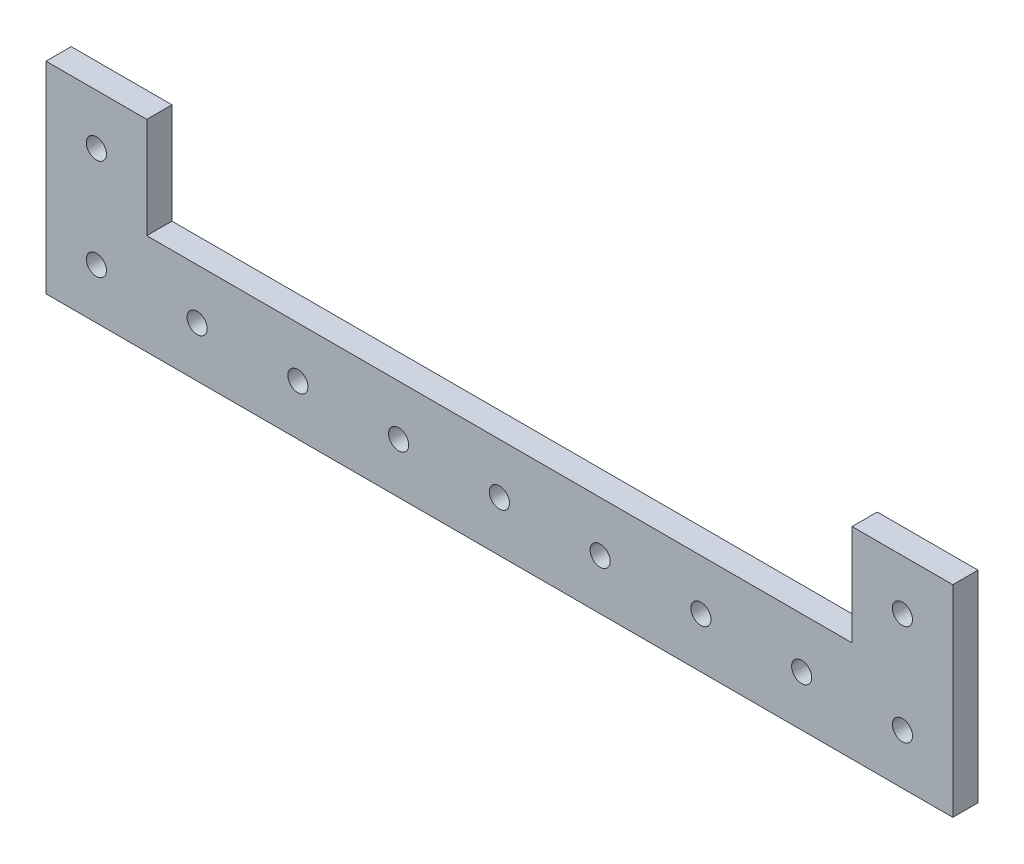
ISO-10303-21;
HEADER;
FILE_DESCRIPTION(('STEP AP214'),'2;1');
FILE_NAME('part.step','',(''),(''),'','','');
FILE_SCHEMA(('AUTOMOTIVE_DESIGN { 1 0 10303 214 1 1 1 1 }'));
ENDSEC;
DATA;
#1=APPLICATION_CONTEXT('core data for automotive mechanical design processes');
#2=APPLICATION_PROTOCOL_DEFINITION('international standard','automotive_design',2000,#1);
#3=PRODUCT_CONTEXT('',#1,'mechanical');
#4=PRODUCT('Part','Part','',(#3));
#5=PRODUCT_RELATED_PRODUCT_CATEGORY('part','',(#4));
#6=PRODUCT_DEFINITION_FORMATION('','',#4);
#7=PRODUCT_DEFINITION_CONTEXT('part definition',#1,'design');
#8=PRODUCT_DEFINITION('design','',#6,#7);
#9=PRODUCT_DEFINITION_SHAPE('','',#8);
#10=(LENGTH_UNIT() NAMED_UNIT(*) SI_UNIT(.MILLI.,.METRE.));
#11=(NAMED_UNIT(*) PLANE_ANGLE_UNIT() SI_UNIT($,.RADIAN.));
#12=(NAMED_UNIT(*) SI_UNIT($,.STERADIAN.) SOLID_ANGLE_UNIT());
#13=UNCERTAINTY_MEASURE_WITH_UNIT(LENGTH_MEASURE(1.E-05),#10,'distance_accuracy_value','');
#14=(GEOMETRIC_REPRESENTATION_CONTEXT(3) GLOBAL_UNCERTAINTY_ASSIGNED_CONTEXT((#13)) GLOBAL_UNIT_ASSIGNED_CONTEXT((#10,
#11,#12)) REPRESENTATION_CONTEXT('',''));
#15=CARTESIAN_POINT('',(0.,0.,0.));
#16=DIRECTION('',(0.,0.,1.));
#17=DIRECTION('',(1.,0.,0.));
#18=AXIS2_PLACEMENT_3D('',#15,#16,#17);
#19=CARTESIAN_POINT('',(228.6,0.,6.35));
#20=DIRECTION('',(0.,1.,0.));
#21=DIRECTION('',(-1.,0.,0.));
#22=AXIS2_PLACEMENT_3D('',#19,#20,#21);
#23=PLANE('',#22);
#24=DIRECTION('',(1.,0.,0.));
#25=VECTOR('',#24,1.);
#26=CARTESIAN_POINT('',(228.6,0.,0.));
#27=LINE('',#26,#25);
#28=CARTESIAN_POINT('',(0.,0.,0.));
#29=VERTEX_POINT('',#28);
#30=CARTESIAN_POINT('',(228.6,0.,0.));
#31=VERTEX_POINT('',#30);
#32=EDGE_CURVE('E140',#29,#31,#27,.T.);
#33=ORIENTED_EDGE('',*,*,#32,.T.);
#34=DIRECTION('',(0.,0.,-1.));
#35=VECTOR('',#34,1.);
#36=CARTESIAN_POINT('',(228.6,0.,6.35));
#37=LINE('',#36,#35);
#38=CARTESIAN_POINT('',(228.6,0.,6.35));
#39=VERTEX_POINT('',#38);
#40=EDGE_CURVE('E11',#39,#31,#37,.T.);
#41=ORIENTED_EDGE('',*,*,#40,.F.);
#42=DIRECTION('',(1.,0.,0.));
#43=VECTOR('',#42,1.);
#44=CARTESIAN_POINT('',(228.6,0.,6.35));
#45=LINE('',#44,#43);
#46=CARTESIAN_POINT('',(0.,0.,6.35));
#47=VERTEX_POINT('',#46);
#48=EDGE_CURVE('E163',#47,#39,#45,.T.);
#49=ORIENTED_EDGE('',*,*,#48,.F.);
#50=DIRECTION('',(0.,0.,-1.));
#51=VECTOR('',#50,1.);
#52=CARTESIAN_POINT('',(0.,0.,6.35));
#53=LINE('',#52,#51);
#54=EDGE_CURVE('E136',#47,#29,#53,.T.);
#55=ORIENTED_EDGE('',*,*,#54,.T.);
#56=EDGE_LOOP('',(#33,#41,#49,#55));
#57=FACE_BOUND('',#56,.T.);
#58=ADVANCED_FACE('F39',(#57),#23,.F.);
#59=CARTESIAN_POINT('',(228.6,50.8,6.35));
#60=DIRECTION('',(-1.,0.,0.));
#61=DIRECTION('',(0.,0.,1.));
#62=AXIS2_PLACEMENT_3D('',#59,#60,#61);
#63=PLANE('',#62);
#64=DIRECTION('',(0.,1.,0.));
#65=VECTOR('',#64,1.);
#66=CARTESIAN_POINT('',(228.6,50.8,0.));
#67=LINE('',#66,#65);
#68=CARTESIAN_POINT('',(228.6,50.8,0.));
#69=VERTEX_POINT('',#68);
#70=EDGE_CURVE('E144',#31,#69,#67,.T.);
#71=ORIENTED_EDGE('',*,*,#70,.T.);
#72=DIRECTION('',(0.,0.,-1.));
#73=VECTOR('',#72,1.);
#74=CARTESIAN_POINT('',(228.6,50.8,6.35));
#75=LINE('',#74,#73);
#76=CARTESIAN_POINT('',(228.6,50.8,6.35));
#77=VERTEX_POINT('',#76);
#78=EDGE_CURVE('E48',#77,#69,#75,.T.);
#79=ORIENTED_EDGE('',*,*,#78,.F.);
#80=DIRECTION('',(0.,1.,0.));
#81=VECTOR('',#80,1.);
#82=CARTESIAN_POINT('',(228.6,50.8,6.35));
#83=LINE('',#82,#81);
#84=EDGE_CURVE('E99',#39,#77,#83,.T.);
#85=ORIENTED_EDGE('',*,*,#84,.F.);
#86=ORIENTED_EDGE('',*,*,#40,.T.);
#87=EDGE_LOOP('',(#71,#79,#85,#86));
#88=FACE_BOUND('',#87,.T.);
#89=ADVANCED_FACE('F323',(#88),#63,.F.);
#90=CARTESIAN_POINT('',(203.2,50.8,6.35));
#91=DIRECTION('',(0.,-1.,0.));
#92=DIRECTION('',(0.,0.,-1.));
#93=AXIS2_PLACEMENT_3D('',#90,#91,#92);
#94=PLANE('',#93);
#95=DIRECTION('',(-1.,0.,0.));
#96=VECTOR('',#95,1.);
#97=CARTESIAN_POINT('',(203.2,50.8,0.));
#98=LINE('',#97,#96);
#99=CARTESIAN_POINT('',(203.2,50.8,0.));
#100=VERTEX_POINT('',#99);
#101=EDGE_CURVE('E148',#69,#100,#98,.T.);
#102=ORIENTED_EDGE('',*,*,#101,.T.);
#103=DIRECTION('',(0.,0.,-1.));
#104=VECTOR('',#103,1.);
#105=CARTESIAN_POINT('',(203.2,50.8,6.35));
#106=LINE('',#105,#104);
#107=CARTESIAN_POINT('',(203.2,50.8,6.35));
#108=VERTEX_POINT('',#107);
#109=EDGE_CURVE('E174',#108,#100,#106,.T.);
#110=ORIENTED_EDGE('',*,*,#109,.F.);
#111=DIRECTION('',(-1.,0.,0.));
#112=VECTOR('',#111,1.);
#113=CARTESIAN_POINT('',(203.2,50.8,6.35));
#114=LINE('',#113,#112);
#115=EDGE_CURVE('E184',#77,#108,#114,.T.);
#116=ORIENTED_EDGE('',*,*,#115,.F.);
#117=ORIENTED_EDGE('',*,*,#78,.T.);
#118=EDGE_LOOP('',(#102,#110,#116,#117));
#119=FACE_BOUND('',#118,.T.);
#120=ADVANCED_FACE('F182',(#119),#94,.F.);
#121=CARTESIAN_POINT('',(203.2,25.4,6.35));
#122=DIRECTION('',(1.,0.,0.));
#123=DIRECTION('',(0.,0.,-1.));
#124=AXIS2_PLACEMENT_3D('',#121,#122,#123);
#125=PLANE('',#124);
#126=DIRECTION('',(0.,-1.,0.));
#127=VECTOR('',#126,1.);
#128=CARTESIAN_POINT('',(203.2,25.4,0.));
#129=LINE('',#128,#127);
#130=CARTESIAN_POINT('',(203.2,25.4,0.));
#131=VERTEX_POINT('',#130);
#132=EDGE_CURVE('E151',#100,#131,#129,.T.);
#133=ORIENTED_EDGE('',*,*,#132,.T.);
#134=DIRECTION('',(0.,0.,-1.));
#135=VECTOR('',#134,1.);
#136=CARTESIAN_POINT('',(203.2,25.4,6.35));
#137=LINE('',#136,#135);
#138=CARTESIAN_POINT('',(203.2,25.4,6.35));
#139=VERTEX_POINT('',#138);
#140=EDGE_CURVE('E170',#139,#131,#137,.T.);
#141=ORIENTED_EDGE('',*,*,#140,.F.);
#142=DIRECTION('',(0.,-1.,0.));
#143=VECTOR('',#142,1.);
#144=CARTESIAN_POINT('',(203.2,25.4,6.35));
#145=LINE('',#144,#143);
#146=EDGE_CURVE('E197',#108,#139,#145,.T.);
#147=ORIENTED_EDGE('',*,*,#146,.F.);
#148=ORIENTED_EDGE('',*,*,#109,.T.);
#149=EDGE_LOOP('',(#133,#141,#147,#148));
#150=FACE_BOUND('',#149,.T.);
#151=ADVANCED_FACE('F192',(#150),#125,.F.);
#152=CARTESIAN_POINT('',(25.4,25.4,6.35));
#153=DIRECTION('',(0.,-1.,0.));
#154=DIRECTION('',(0.,0.,-1.));
#155=AXIS2_PLACEMENT_3D('',#152,#153,#154);
#156=PLANE('',#155);
#157=DIRECTION('',(-1.,0.,0.));
#158=VECTOR('',#157,1.);
#159=CARTESIAN_POINT('',(25.4,25.4,0.));
#160=LINE('',#159,#158);
#161=CARTESIAN_POINT('',(25.4,25.4,0.));
#162=VERTEX_POINT('',#161);
#163=EDGE_CURVE('E154',#131,#162,#160,.T.);
#164=ORIENTED_EDGE('',*,*,#163,.T.);
#165=DIRECTION('',(0.,0.,-1.));
#166=VECTOR('',#165,1.);
#167=CARTESIAN_POINT('',(25.4,25.4,6.35));
#168=LINE('',#167,#166);
#169=CARTESIAN_POINT('',(25.4,25.4,6.35));
#170=VERTEX_POINT('',#169);
#171=EDGE_CURVE('E129',#170,#162,#168,.T.);
#172=ORIENTED_EDGE('',*,*,#171,.F.);
#173=DIRECTION('',(-1.,0.,0.));
#174=VECTOR('',#173,1.);
#175=CARTESIAN_POINT('',(25.4,25.4,6.35));
#176=LINE('',#175,#174);
#177=EDGE_CURVE('E118',#139,#170,#176,.T.);
#178=ORIENTED_EDGE('',*,*,#177,.F.);
#179=ORIENTED_EDGE('',*,*,#140,.T.);
#180=EDGE_LOOP('',(#164,#172,#178,#179));
#181=FACE_BOUND('',#180,.T.);
#182=ADVANCED_FACE('F195',(#181),#156,.F.);
#183=CARTESIAN_POINT('',(25.4,50.8,6.35));
#184=DIRECTION('',(-1.,0.,0.));
#185=DIRECTION('',(0.,-1.,0.));
#186=AXIS2_PLACEMENT_3D('',#183,#184,#185);
#187=PLANE('',#186);
#188=DIRECTION('',(0.,1.,0.));
#189=VECTOR('',#188,1.);
#190=CARTESIAN_POINT('',(25.4,50.8,0.));
#191=LINE('',#190,#189);
#192=CARTESIAN_POINT('',(25.4,50.8,0.));
#193=VERTEX_POINT('',#192);
#194=EDGE_CURVE('E127',#162,#193,#191,.T.);
#195=ORIENTED_EDGE('',*,*,#194,.T.);
#196=DIRECTION('',(0.,0.,-1.));
#197=VECTOR('',#196,1.);
#198=CARTESIAN_POINT('',(25.4,50.8,6.35));
#199=LINE('',#198,#197);
#200=CARTESIAN_POINT('',(25.4,50.8,6.35));
#201=VERTEX_POINT('',#200);
#202=EDGE_CURVE('E124',#201,#193,#199,.T.);
#203=ORIENTED_EDGE('',*,*,#202,.F.);
#204=DIRECTION('',(0.,1.,0.));
#205=VECTOR('',#204,1.);
#206=CARTESIAN_POINT('',(25.4,50.8,6.35));
#207=LINE('',#206,#205);
#208=EDGE_CURVE('E112',#170,#201,#207,.T.);
#209=ORIENTED_EDGE('',*,*,#208,.F.);
#210=ORIENTED_EDGE('',*,*,#171,.T.);
#211=EDGE_LOOP('',(#195,#203,#209,#210));
#212=FACE_BOUND('',#211,.T.);
#213=ADVANCED_FACE('F125',(#212),#187,.F.);
#214=CARTESIAN_POINT('',(0.,50.8,6.35));
#215=DIRECTION('',(0.,-1.,0.));
#216=DIRECTION('',(0.,0.,-1.));
#217=AXIS2_PLACEMENT_3D('',#214,#215,#216);
#218=PLANE('',#217);
#219=DIRECTION('',(-1.,0.,0.));
#220=VECTOR('',#219,1.);
#221=CARTESIAN_POINT('',(0.,50.8,0.));
#222=LINE('',#221,#220);
#223=CARTESIAN_POINT('',(0.,50.8,0.));
#224=VERTEX_POINT('',#223);
#225=EDGE_CURVE('E85',#193,#224,#222,.T.);
#226=ORIENTED_EDGE('',*,*,#225,.T.);
#227=DIRECTION('',(0.,0.,-1.));
#228=VECTOR('',#227,1.);
#229=CARTESIAN_POINT('',(0.,50.8,6.35));
#230=LINE('',#229,#228);
#231=CARTESIAN_POINT('',(0.,50.8,6.35));
#232=VERTEX_POINT('',#231);
#233=EDGE_CURVE('E130',#232,#224,#230,.T.);
#234=ORIENTED_EDGE('',*,*,#233,.F.);
#235=DIRECTION('',(-1.,0.,0.));
#236=VECTOR('',#235,1.);
#237=CARTESIAN_POINT('',(0.,50.8,6.35));
#238=LINE('',#237,#236);
#239=EDGE_CURVE('E116',#201,#232,#238,.T.);
#240=ORIENTED_EDGE('',*,*,#239,.F.);
#241=ORIENTED_EDGE('',*,*,#202,.T.);
#242=EDGE_LOOP('',(#226,#234,#240,#241));
#243=FACE_BOUND('',#242,.T.);
#244=ADVANCED_FACE('F132',(#243),#218,.F.);
#245=CARTESIAN_POINT('',(0.,0.,6.35));
#246=DIRECTION('',(1.,0.,0.));
#247=DIRECTION('',(0.,0.,-1.));
#248=AXIS2_PLACEMENT_3D('',#245,#246,#247);
#249=PLANE('',#248);
#250=DIRECTION('',(0.,-1.,0.));
#251=VECTOR('',#250,1.);
#252=CARTESIAN_POINT('',(0.,0.,0.));
#253=LINE('',#252,#251);
#254=EDGE_CURVE('E91',#224,#29,#253,.T.);
#255=ORIENTED_EDGE('',*,*,#254,.T.);
#256=ORIENTED_EDGE('',*,*,#54,.F.);
#257=DIRECTION('',(0.,-1.,0.));
#258=VECTOR('',#257,1.);
#259=CARTESIAN_POINT('',(0.,0.,6.35));
#260=LINE('',#259,#258);
#261=EDGE_CURVE('E56',#232,#47,#260,.T.);
#262=ORIENTED_EDGE('',*,*,#261,.F.);
#263=ORIENTED_EDGE('',*,*,#233,.T.);
#264=EDGE_LOOP('',(#255,#256,#262,#263));
#265=FACE_BOUND('',#264,.T.);
#266=ADVANCED_FACE('F307',(#265),#249,.F.);
#267=CARTESIAN_POINT('',(0.,0.,6.35));
#268=DIRECTION('',(0.,0.,-1.));
#269=DIRECTION('',(-1.,0.,0.));
#270=AXIS2_PLACEMENT_3D('',#267,#268,#269);
#271=PLANE('',#270);
#272=CARTESIAN_POINT('',(215.9,38.0999999999999,6.35));
#273=DIRECTION('',(0.,0.,1.));
#274=DIRECTION('',(-1.,0.,0.));
#275=AXIS2_PLACEMENT_3D('',#272,#273,#274);
#276=CIRCLE('',#275,2.53999999999996);
#277=CARTESIAN_POINT('',(213.36,38.0999999999999,6.35));
#278=VERTEX_POINT('',#277);
#279=EDGE_CURVE('E215',#278,#278,#276,.T.);
#280=ORIENTED_EDGE('',*,*,#279,.F.);
#281=EDGE_LOOP('',(#280));
#282=FACE_BOUND('',#281,.T.);
#283=CARTESIAN_POINT('',(215.9,12.7,6.35));
#284=DIRECTION('',(0.,0.,1.));
#285=DIRECTION('',(1.,0.,0.));
#286=AXIS2_PLACEMENT_3D('',#283,#284,#285);
#287=CIRCLE('',#286,2.54000000000001);
#288=CARTESIAN_POINT('',(218.44,12.7,6.35));
#289=VERTEX_POINT('',#288);
#290=EDGE_CURVE('E223',#289,#289,#287,.T.);
#291=ORIENTED_EDGE('',*,*,#290,.F.);
#292=EDGE_LOOP('',(#291));
#293=FACE_BOUND('',#292,.T.);
#294=CARTESIAN_POINT('',(190.5,12.7,6.35));
#295=DIRECTION('',(0.,0.,1.));
#296=DIRECTION('',(1.,0.,0.));
#297=AXIS2_PLACEMENT_3D('',#294,#295,#296);
#298=CIRCLE('',#297,2.53999999999998);
#299=CARTESIAN_POINT('',(193.04,12.7,6.35));
#300=VERTEX_POINT('',#299);
#301=EDGE_CURVE('E231',#300,#300,#298,.T.);
#302=ORIENTED_EDGE('',*,*,#301,.F.);
#303=EDGE_LOOP('',(#302));
#304=FACE_BOUND('',#303,.T.);
#305=CARTESIAN_POINT('',(165.1,12.7,6.35));
#306=DIRECTION('',(0.,0.,1.));
#307=DIRECTION('',(1.,0.,0.));
#308=AXIS2_PLACEMENT_3D('',#305,#306,#307);
#309=CIRCLE('',#308,2.54000000000001);
#310=CARTESIAN_POINT('',(167.64,12.7,6.35));
#311=VERTEX_POINT('',#310);
#312=EDGE_CURVE('E239',#311,#311,#309,.T.);
#313=ORIENTED_EDGE('',*,*,#312,.F.);
#314=EDGE_LOOP('',(#313));
#315=FACE_BOUND('',#314,.T.);
#316=CARTESIAN_POINT('',(139.7,12.7,6.35));
#317=DIRECTION('',(0.,0.,1.));
#318=DIRECTION('',(1.,0.,0.));
#319=AXIS2_PLACEMENT_3D('',#316,#317,#318);
#320=CIRCLE('',#319,2.54000000000001);
#321=CARTESIAN_POINT('',(142.24,12.7,6.35));
#322=VERTEX_POINT('',#321);
#323=EDGE_CURVE('E247',#322,#322,#320,.T.);
#324=ORIENTED_EDGE('',*,*,#323,.F.);
#325=EDGE_LOOP('',(#324));
#326=FACE_BOUND('',#325,.T.);
#327=CARTESIAN_POINT('',(114.3,12.7,6.35));
#328=DIRECTION('',(0.,0.,1.));
#329=DIRECTION('',(1.,0.,0.));
#330=AXIS2_PLACEMENT_3D('',#327,#328,#329);
#331=CIRCLE('',#330,2.54);
#332=CARTESIAN_POINT('',(116.84,12.7,6.35));
#333=VERTEX_POINT('',#332);
#334=EDGE_CURVE('E255',#333,#333,#331,.T.);
#335=ORIENTED_EDGE('',*,*,#334,.F.);
#336=EDGE_LOOP('',(#335));
#337=FACE_BOUND('',#336,.T.);
#338=CARTESIAN_POINT('',(88.9,12.7,6.35));
#339=DIRECTION('',(0.,0.,1.));
#340=DIRECTION('',(1.,0.,0.));
#341=AXIS2_PLACEMENT_3D('',#338,#339,#340);
#342=CIRCLE('',#341,2.54);
#343=CARTESIAN_POINT('',(91.44,12.7,6.35));
#344=VERTEX_POINT('',#343);
#345=EDGE_CURVE('E263',#344,#344,#342,.T.);
#346=ORIENTED_EDGE('',*,*,#345,.F.);
#347=EDGE_LOOP('',(#346));
#348=FACE_BOUND('',#347,.T.);
#349=CARTESIAN_POINT('',(63.5,12.7,6.35));
#350=DIRECTION('',(0.,0.,1.));
#351=DIRECTION('',(1.,0.,0.));
#352=AXIS2_PLACEMENT_3D('',#349,#350,#351);
#353=CIRCLE('',#352,2.54);
#354=CARTESIAN_POINT('',(66.04,12.7,6.35));
#355=VERTEX_POINT('',#354);
#356=EDGE_CURVE('E271',#355,#355,#353,.T.);
#357=ORIENTED_EDGE('',*,*,#356,.F.);
#358=EDGE_LOOP('',(#357));
#359=FACE_BOUND('',#358,.T.);
#360=CARTESIAN_POINT('',(38.1,12.7,6.35));
#361=DIRECTION('',(0.,0.,1.));
#362=DIRECTION('',(1.,0.,0.));
#363=AXIS2_PLACEMENT_3D('',#360,#361,#362);
#364=CIRCLE('',#363,2.54);
#365=CARTESIAN_POINT('',(40.64,12.7,6.35));
#366=VERTEX_POINT('',#365);
#367=EDGE_CURVE('E279',#366,#366,#364,.T.);
#368=ORIENTED_EDGE('',*,*,#367,.F.);
#369=EDGE_LOOP('',(#368));
#370=FACE_BOUND('',#369,.T.);
#371=CARTESIAN_POINT('',(12.7,12.7,6.35));
#372=DIRECTION('',(0.,0.,1.));
#373=DIRECTION('',(1.,0.,0.));
#374=AXIS2_PLACEMENT_3D('',#371,#372,#373);
#375=CIRCLE('',#374,2.54);
#376=CARTESIAN_POINT('',(15.24,12.7,6.35));
#377=VERTEX_POINT('',#376);
#378=EDGE_CURVE('E287',#377,#377,#375,.T.);
#379=ORIENTED_EDGE('',*,*,#378,.F.);
#380=EDGE_LOOP('',(#379));
#381=FACE_BOUND('',#380,.T.);
#382=CARTESIAN_POINT('',(12.7,38.1,6.35));
#383=DIRECTION('',(0.,0.,1.));
#384=DIRECTION('',(1.,0.,0.));
#385=AXIS2_PLACEMENT_3D('',#382,#383,#384);
#386=CIRCLE('',#385,2.54);
#387=CARTESIAN_POINT('',(15.24,38.1,6.35));
#388=VERTEX_POINT('',#387);
#389=EDGE_CURVE('E207',#388,#388,#386,.T.);
#390=ORIENTED_EDGE('',*,*,#389,.F.);
#391=EDGE_LOOP('',(#390));
#392=FACE_BOUND('',#391,.T.);
#393=ORIENTED_EDGE('',*,*,#48,.T.);
#394=ORIENTED_EDGE('',*,*,#84,.T.);
#395=ORIENTED_EDGE('',*,*,#115,.T.);
#396=ORIENTED_EDGE('',*,*,#146,.T.);
#397=ORIENTED_EDGE('',*,*,#177,.T.);
#398=ORIENTED_EDGE('',*,*,#208,.T.);
#399=ORIENTED_EDGE('',*,*,#239,.T.);
#400=ORIENTED_EDGE('',*,*,#261,.T.);
#401=EDGE_LOOP('',(#393,#394,#395,#396,#397,#398,#399,#400));
#402=FACE_BOUND('',#401,.T.);
#403=ADVANCED_FACE('F114',(#282,#293,#304,#315,#326,#337,#348,#359,#370,#381,#392,#402),#271,.F.);
#404=CARTESIAN_POINT('',(0.,0.,0.));
#405=DIRECTION('',(0.,0.,-1.));
#406=DIRECTION('',(-1.,0.,0.));
#407=AXIS2_PLACEMENT_3D('',#404,#405,#406);
#408=PLANE('',#407);
#409=CARTESIAN_POINT('',(215.9,38.0999999999999,0.));
#410=DIRECTION('',(0.,0.,1.));
#411=DIRECTION('',(-1.,0.,0.));
#412=AXIS2_PLACEMENT_3D('',#409,#410,#411);
#413=CIRCLE('',#412,2.53999999999996);
#414=CARTESIAN_POINT('',(213.36,38.0999999999999,0.));
#415=VERTEX_POINT('',#414);
#416=EDGE_CURVE('E219',#415,#415,#413,.T.);
#417=ORIENTED_EDGE('',*,*,#416,.T.);
#418=EDGE_LOOP('',(#417));
#419=FACE_BOUND('',#418,.T.);
#420=CARTESIAN_POINT('',(215.9,12.7,0.));
#421=DIRECTION('',(0.,0.,1.));
#422=DIRECTION('',(1.,0.,0.));
#423=AXIS2_PLACEMENT_3D('',#420,#421,#422);
#424=CIRCLE('',#423,2.54000000000001);
#425=CARTESIAN_POINT('',(218.44,12.7,0.));
#426=VERTEX_POINT('',#425);
#427=EDGE_CURVE('E227',#426,#426,#424,.T.);
#428=ORIENTED_EDGE('',*,*,#427,.T.);
#429=EDGE_LOOP('',(#428));
#430=FACE_BOUND('',#429,.T.);
#431=CARTESIAN_POINT('',(190.5,12.7,0.));
#432=DIRECTION('',(0.,0.,1.));
#433=DIRECTION('',(1.,0.,0.));
#434=AXIS2_PLACEMENT_3D('',#431,#432,#433);
#435=CIRCLE('',#434,2.53999999999998);
#436=CARTESIAN_POINT('',(193.04,12.7,0.));
#437=VERTEX_POINT('',#436);
#438=EDGE_CURVE('E235',#437,#437,#435,.T.);
#439=ORIENTED_EDGE('',*,*,#438,.T.);
#440=EDGE_LOOP('',(#439));
#441=FACE_BOUND('',#440,.T.);
#442=CARTESIAN_POINT('',(165.1,12.7,0.));
#443=DIRECTION('',(0.,0.,1.));
#444=DIRECTION('',(1.,0.,0.));
#445=AXIS2_PLACEMENT_3D('',#442,#443,#444);
#446=CIRCLE('',#445,2.54000000000001);
#447=CARTESIAN_POINT('',(167.64,12.7,0.));
#448=VERTEX_POINT('',#447);
#449=EDGE_CURVE('E243',#448,#448,#446,.T.);
#450=ORIENTED_EDGE('',*,*,#449,.T.);
#451=EDGE_LOOP('',(#450));
#452=FACE_BOUND('',#451,.T.);
#453=CARTESIAN_POINT('',(139.7,12.7,0.));
#454=DIRECTION('',(0.,0.,1.));
#455=DIRECTION('',(1.,0.,0.));
#456=AXIS2_PLACEMENT_3D('',#453,#454,#455);
#457=CIRCLE('',#456,2.54000000000001);
#458=CARTESIAN_POINT('',(142.24,12.7,0.));
#459=VERTEX_POINT('',#458);
#460=EDGE_CURVE('E251',#459,#459,#457,.T.);
#461=ORIENTED_EDGE('',*,*,#460,.T.);
#462=EDGE_LOOP('',(#461));
#463=FACE_BOUND('',#462,.T.);
#464=CARTESIAN_POINT('',(114.3,12.7,0.));
#465=DIRECTION('',(0.,0.,1.));
#466=DIRECTION('',(1.,0.,0.));
#467=AXIS2_PLACEMENT_3D('',#464,#465,#466);
#468=CIRCLE('',#467,2.54);
#469=CARTESIAN_POINT('',(116.84,12.7,0.));
#470=VERTEX_POINT('',#469);
#471=EDGE_CURVE('E259',#470,#470,#468,.T.);
#472=ORIENTED_EDGE('',*,*,#471,.T.);
#473=EDGE_LOOP('',(#472));
#474=FACE_BOUND('',#473,.T.);
#475=CARTESIAN_POINT('',(88.9,12.7,0.));
#476=DIRECTION('',(0.,0.,1.));
#477=DIRECTION('',(1.,0.,0.));
#478=AXIS2_PLACEMENT_3D('',#475,#476,#477);
#479=CIRCLE('',#478,2.54);
#480=CARTESIAN_POINT('',(91.44,12.7,0.));
#481=VERTEX_POINT('',#480);
#482=EDGE_CURVE('E267',#481,#481,#479,.T.);
#483=ORIENTED_EDGE('',*,*,#482,.T.);
#484=EDGE_LOOP('',(#483));
#485=FACE_BOUND('',#484,.T.);
#486=CARTESIAN_POINT('',(63.5,12.7,0.));
#487=DIRECTION('',(0.,0.,1.));
#488=DIRECTION('',(1.,0.,0.));
#489=AXIS2_PLACEMENT_3D('',#486,#487,#488);
#490=CIRCLE('',#489,2.54);
#491=CARTESIAN_POINT('',(66.04,12.7,0.));
#492=VERTEX_POINT('',#491);
#493=EDGE_CURVE('E275',#492,#492,#490,.T.);
#494=ORIENTED_EDGE('',*,*,#493,.T.);
#495=EDGE_LOOP('',(#494));
#496=FACE_BOUND('',#495,.T.);
#497=CARTESIAN_POINT('',(38.1,12.7,0.));
#498=DIRECTION('',(0.,0.,1.));
#499=DIRECTION('',(1.,0.,0.));
#500=AXIS2_PLACEMENT_3D('',#497,#498,#499);
#501=CIRCLE('',#500,2.54);
#502=CARTESIAN_POINT('',(40.64,12.7,0.));
#503=VERTEX_POINT('',#502);
#504=EDGE_CURVE('E283',#503,#503,#501,.T.);
#505=ORIENTED_EDGE('',*,*,#504,.T.);
#506=EDGE_LOOP('',(#505));
#507=FACE_BOUND('',#506,.T.);
#508=CARTESIAN_POINT('',(12.7,12.7,0.));
#509=DIRECTION('',(0.,0.,1.));
#510=DIRECTION('',(1.,0.,0.));
#511=AXIS2_PLACEMENT_3D('',#508,#509,#510);
#512=CIRCLE('',#511,2.54);
#513=CARTESIAN_POINT('',(15.24,12.7,0.));
#514=VERTEX_POINT('',#513);
#515=EDGE_CURVE('E211',#514,#514,#512,.T.);
#516=ORIENTED_EDGE('',*,*,#515,.T.);
#517=EDGE_LOOP('',(#516));
#518=FACE_BOUND('',#517,.T.);
#519=CARTESIAN_POINT('',(12.7,38.1,0.));
#520=DIRECTION('',(0.,0.,1.));
#521=DIRECTION('',(1.,0.,0.));
#522=AXIS2_PLACEMENT_3D('',#519,#520,#521);
#523=CIRCLE('',#522,2.54);
#524=CARTESIAN_POINT('',(15.24,38.1,0.));
#525=VERTEX_POINT('',#524);
#526=EDGE_CURVE('E145',#525,#525,#523,.T.);
#527=ORIENTED_EDGE('',*,*,#526,.T.);
#528=EDGE_LOOP('',(#527));
#529=FACE_BOUND('',#528,.T.);
#530=ORIENTED_EDGE('',*,*,#32,.F.);
#531=ORIENTED_EDGE('',*,*,#254,.F.);
#532=ORIENTED_EDGE('',*,*,#225,.F.);
#533=ORIENTED_EDGE('',*,*,#194,.F.);
#534=ORIENTED_EDGE('',*,*,#163,.F.);
#535=ORIENTED_EDGE('',*,*,#132,.F.);
#536=ORIENTED_EDGE('',*,*,#101,.F.);
#537=ORIENTED_EDGE('',*,*,#70,.F.);
#538=EDGE_LOOP('',(#530,#531,#532,#533,#534,#535,#536,#537));
#539=FACE_BOUND('',#538,.T.);
#540=ADVANCED_FACE('F188',(#419,#430,#441,#452,#463,#474,#485,#496,#507,#518,#529,#539),#408,.T.);
#541=CARTESIAN_POINT('',(12.7,38.1,0.));
#542=DIRECTION('',(0.,0.,1.));
#543=DIRECTION('',(1.,0.,0.));
#544=AXIS2_PLACEMENT_3D('',#541,#542,#543);
#545=CYLINDRICAL_SURFACE('',#544,2.54);
#546=ORIENTED_EDGE('',*,*,#526,.F.);
#547=EDGE_LOOP('',(#546));
#548=FACE_BOUND('',#547,.T.);
#549=ORIENTED_EDGE('',*,*,#389,.T.);
#550=EDGE_LOOP('',(#549));
#551=FACE_BOUND('',#550,.T.);
#552=ADVANCED_FACE('F301',(#548,#551),#545,.F.);
#553=CARTESIAN_POINT('',(12.7,12.7,0.));
#554=DIRECTION('',(0.,0.,1.));
#555=DIRECTION('',(1.,0.,0.));
#556=AXIS2_PLACEMENT_3D('',#553,#554,#555);
#557=CYLINDRICAL_SURFACE('',#556,2.54);
#558=ORIENTED_EDGE('',*,*,#515,.F.);
#559=EDGE_LOOP('',(#558));
#560=FACE_BOUND('',#559,.T.);
#561=ORIENTED_EDGE('',*,*,#378,.T.);
#562=EDGE_LOOP('',(#561));
#563=FACE_BOUND('',#562,.T.);
#564=ADVANCED_FACE('F297',(#560,#563),#557,.F.);
#565=CARTESIAN_POINT('',(38.1,12.7,0.));
#566=DIRECTION('',(0.,0.,1.));
#567=DIRECTION('',(1.,0.,0.));
#568=AXIS2_PLACEMENT_3D('',#565,#566,#567);
#569=CYLINDRICAL_SURFACE('',#568,2.54);
#570=ORIENTED_EDGE('',*,*,#504,.F.);
#571=EDGE_LOOP('',(#570));
#572=FACE_BOUND('',#571,.T.);
#573=ORIENTED_EDGE('',*,*,#367,.T.);
#574=EDGE_LOOP('',(#573));
#575=FACE_BOUND('',#574,.T.);
#576=ADVANCED_FACE('F300',(#572,#575),#569,.F.);
#577=CARTESIAN_POINT('',(63.5,12.7,0.));
#578=DIRECTION('',(0.,0.,1.));
#579=DIRECTION('',(1.,0.,0.));
#580=AXIS2_PLACEMENT_3D('',#577,#578,#579);
#581=CYLINDRICAL_SURFACE('',#580,2.54);
#582=ORIENTED_EDGE('',*,*,#493,.F.);
#583=EDGE_LOOP('',(#582));
#584=FACE_BOUND('',#583,.T.);
#585=ORIENTED_EDGE('',*,*,#356,.T.);
#586=EDGE_LOOP('',(#585));
#587=FACE_BOUND('',#586,.T.);
#588=ADVANCED_FACE('F399',(#584,#587),#581,.F.);
#589=CARTESIAN_POINT('',(88.9,12.7,0.));
#590=DIRECTION('',(0.,0.,1.));
#591=DIRECTION('',(1.,0.,0.));
#592=AXIS2_PLACEMENT_3D('',#589,#590,#591);
#593=CYLINDRICAL_SURFACE('',#592,2.54);
#594=ORIENTED_EDGE('',*,*,#482,.F.);
#595=EDGE_LOOP('',(#594));
#596=FACE_BOUND('',#595,.T.);
#597=ORIENTED_EDGE('',*,*,#345,.T.);
#598=EDGE_LOOP('',(#597));
#599=FACE_BOUND('',#598,.T.);
#600=ADVANCED_FACE('F409',(#596,#599),#593,.F.);
#601=CARTESIAN_POINT('',(114.3,12.7,0.));
#602=DIRECTION('',(0.,0.,1.));
#603=DIRECTION('',(1.,0.,0.));
#604=AXIS2_PLACEMENT_3D('',#601,#602,#603);
#605=CYLINDRICAL_SURFACE('',#604,2.54);
#606=ORIENTED_EDGE('',*,*,#471,.F.);
#607=EDGE_LOOP('',(#606));
#608=FACE_BOUND('',#607,.T.);
#609=ORIENTED_EDGE('',*,*,#334,.T.);
#610=EDGE_LOOP('',(#609));
#611=FACE_BOUND('',#610,.T.);
#612=ADVANCED_FACE('F419',(#608,#611),#605,.F.);
#613=CARTESIAN_POINT('',(139.7,12.7,0.));
#614=DIRECTION('',(0.,0.,1.));
#615=DIRECTION('',(1.,0.,0.));
#616=AXIS2_PLACEMENT_3D('',#613,#614,#615);
#617=CYLINDRICAL_SURFACE('',#616,2.54000000000001);
#618=ORIENTED_EDGE('',*,*,#460,.F.);
#619=EDGE_LOOP('',(#618));
#620=FACE_BOUND('',#619,.T.);
#621=ORIENTED_EDGE('',*,*,#323,.T.);
#622=EDGE_LOOP('',(#621));
#623=FACE_BOUND('',#622,.T.);
#624=ADVANCED_FACE('F429',(#620,#623),#617,.F.);
#625=CARTESIAN_POINT('',(165.1,12.7,0.));
#626=DIRECTION('',(0.,0.,1.));
#627=DIRECTION('',(1.,0.,0.));
#628=AXIS2_PLACEMENT_3D('',#625,#626,#627);
#629=CYLINDRICAL_SURFACE('',#628,2.54000000000001);
#630=ORIENTED_EDGE('',*,*,#449,.F.);
#631=EDGE_LOOP('',(#630));
#632=FACE_BOUND('',#631,.T.);
#633=ORIENTED_EDGE('',*,*,#312,.T.);
#634=EDGE_LOOP('',(#633));
#635=FACE_BOUND('',#634,.T.);
#636=ADVANCED_FACE('F439',(#632,#635),#629,.F.);
#637=CARTESIAN_POINT('',(190.5,12.7,0.));
#638=DIRECTION('',(0.,0.,1.));
#639=DIRECTION('',(1.,0.,0.));
#640=AXIS2_PLACEMENT_3D('',#637,#638,#639);
#641=CYLINDRICAL_SURFACE('',#640,2.53999999999998);
#642=ORIENTED_EDGE('',*,*,#438,.F.);
#643=EDGE_LOOP('',(#642));
#644=FACE_BOUND('',#643,.T.);
#645=ORIENTED_EDGE('',*,*,#301,.T.);
#646=EDGE_LOOP('',(#645));
#647=FACE_BOUND('',#646,.T.);
#648=ADVANCED_FACE('F449',(#644,#647),#641,.F.);
#649=CARTESIAN_POINT('',(215.9,12.7,0.));
#650=DIRECTION('',(0.,0.,1.));
#651=DIRECTION('',(1.,0.,0.));
#652=AXIS2_PLACEMENT_3D('',#649,#650,#651);
#653=CYLINDRICAL_SURFACE('',#652,2.54000000000001);
#654=ORIENTED_EDGE('',*,*,#427,.F.);
#655=EDGE_LOOP('',(#654));
#656=FACE_BOUND('',#655,.T.);
#657=ORIENTED_EDGE('',*,*,#290,.T.);
#658=EDGE_LOOP('',(#657));
#659=FACE_BOUND('',#658,.T.);
#660=ADVANCED_FACE('F459',(#656,#659),#653,.F.);
#661=CARTESIAN_POINT('',(215.9,38.0999999999999,0.));
#662=DIRECTION('',(0.,0.,1.));
#663=DIRECTION('',(1.,0.,0.));
#664=AXIS2_PLACEMENT_3D('',#661,#662,#663);
#665=CYLINDRICAL_SURFACE('',#664,2.53999999999996);
#666=ORIENTED_EDGE('',*,*,#416,.F.);
#667=EDGE_LOOP('',(#666));
#668=FACE_BOUND('',#667,.T.);
#669=ORIENTED_EDGE('',*,*,#279,.T.);
#670=EDGE_LOOP('',(#669));
#671=FACE_BOUND('',#670,.T.);
#672=ADVANCED_FACE('F469',(#668,#671),#665,.F.);
#673=CLOSED_SHELL('',(#58,#89,#120,#151,#182,#213,#244,#266,#403,#540,#552,#564,#576,#588,#600,
#612,#624,#636,#648,#660,#672));
#674=MANIFOLD_SOLID_BREP('B2',#673);
#675=ADVANCED_BREP_SHAPE_REPRESENTATION('',(#18,#674),#14);
#676=SHAPE_DEFINITION_REPRESENTATION(#9,#675);
ENDSEC;
END-ISO-10303-21;
